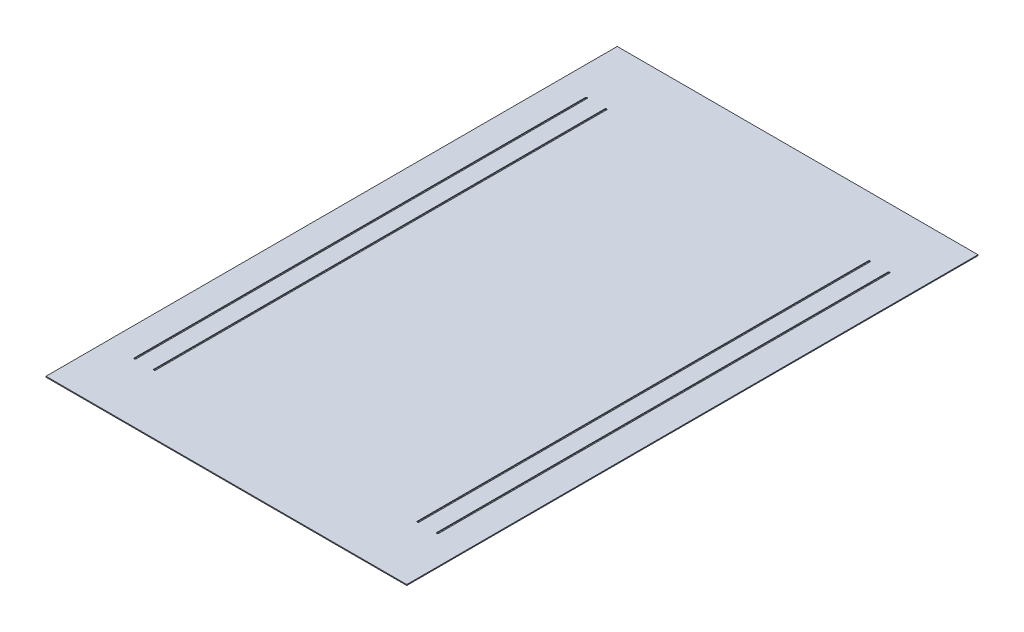
ISO-10303-21;
HEADER;
FILE_DESCRIPTION(('STEP AP214'),'2;1');
FILE_NAME('part.step','',(''),(''),'','','');
FILE_SCHEMA(('AUTOMOTIVE_DESIGN { 1 0 10303 214 1 1 1 1 }'));
ENDSEC;
DATA;
#1=APPLICATION_CONTEXT('core data for automotive mechanical design processes');
#2=APPLICATION_PROTOCOL_DEFINITION('international standard','automotive_design',2000,#1);
#3=PRODUCT_CONTEXT('',#1,'mechanical');
#4=PRODUCT('Part','Part','',(#3));
#5=PRODUCT_RELATED_PRODUCT_CATEGORY('part','',(#4));
#6=PRODUCT_DEFINITION_FORMATION('','',#4);
#7=PRODUCT_DEFINITION_CONTEXT('part definition',#1,'design');
#8=PRODUCT_DEFINITION('design','',#6,#7);
#9=PRODUCT_DEFINITION_SHAPE('','',#8);
#10=(LENGTH_UNIT() NAMED_UNIT(*) SI_UNIT(.MILLI.,.METRE.));
#11=(NAMED_UNIT(*) PLANE_ANGLE_UNIT() SI_UNIT($,.RADIAN.));
#12=(NAMED_UNIT(*) SI_UNIT($,.STERADIAN.) SOLID_ANGLE_UNIT());
#13=UNCERTAINTY_MEASURE_WITH_UNIT(LENGTH_MEASURE(1.E-05),#10,'distance_accuracy_value','');
#14=(GEOMETRIC_REPRESENTATION_CONTEXT(3) GLOBAL_UNCERTAINTY_ASSIGNED_CONTEXT((#13)) GLOBAL_UNIT_ASSIGNED_CONTEXT((#10,
#11,#12)) REPRESENTATION_CONTEXT('',''));
#15=CARTESIAN_POINT('',(0.,0.,0.));
#16=DIRECTION('',(0.,0.,1.));
#17=DIRECTION('',(1.,0.,0.));
#18=AXIS2_PLACEMENT_3D('',#15,#16,#17);
#19=CARTESIAN_POINT('',(0.,3.,0.));
#20=DIRECTION('',(0.,1.,0.));
#21=DIRECTION('',(0.,0.,1.));
#22=AXIS2_PLACEMENT_3D('',#19,#20,#21);
#23=PLANE('',#22);
#24=DIRECTION('',(0.,0.,1.));
#25=VECTOR('',#24,1.);
#26=CARTESIAN_POINT('',(435.,3.,-750.));
#27=LINE('',#26,#25);
#28=CARTESIAN_POINT('',(435.,3.,-750.));
#29=VERTEX_POINT('',#28);
#30=CARTESIAN_POINT('',(435.,3.,750.));
#31=VERTEX_POINT('',#30);
#32=EDGE_CURVE('E208',#29,#31,#27,.T.);
#33=ORIENTED_EDGE('',*,*,#32,.F.);
#34=CARTESIAN_POINT('',(438.,3.,-750.));
#35=DIRECTION('',(0.,1.,0.));
#36=DIRECTION('',(0.,0.,-1.));
#37=AXIS2_PLACEMENT_3D('',#34,#35,#36);
#38=CIRCLE('',#37,3.);
#39=CARTESIAN_POINT('',(441.,3.,-750.));
#40=VERTEX_POINT('',#39);
#41=EDGE_CURVE('E206',#40,#29,#38,.T.);
#42=ORIENTED_EDGE('',*,*,#41,.F.);
#43=DIRECTION('',(0.,0.,-1.));
#44=VECTOR('',#43,1.);
#45=CARTESIAN_POINT('',(441.,3.,-750.));
#46=LINE('',#45,#44);
#47=CARTESIAN_POINT('',(441.,3.,750.));
#48=VERTEX_POINT('',#47);
#49=EDGE_CURVE('E214',#48,#40,#46,.T.);
#50=ORIENTED_EDGE('',*,*,#49,.F.);
#51=CARTESIAN_POINT('',(438.,3.,750.));
#52=DIRECTION('',(0.,1.,0.));
#53=DIRECTION('',(0.,0.,-1.));
#54=AXIS2_PLACEMENT_3D('',#51,#52,#53);
#55=CIRCLE('',#54,3.00000000000014);
#56=EDGE_CURVE('E211',#31,#48,#55,.T.);
#57=ORIENTED_EDGE('',*,*,#56,.F.);
#58=EDGE_LOOP('',(#33,#42,#50,#57));
#59=FACE_BOUND('',#58,.T.);
#60=DIRECTION('',(0.,0.,1.));
#61=VECTOR('',#60,1.);
#62=CARTESIAN_POINT('',(-506.,3.,-750.));
#63=LINE('',#62,#61);
#64=CARTESIAN_POINT('',(-506.,3.,-750.));
#65=VERTEX_POINT('',#64);
#66=CARTESIAN_POINT('',(-506.,3.,750.));
#67=VERTEX_POINT('',#66);
#68=EDGE_CURVE('E270',#65,#67,#63,.T.);
#69=ORIENTED_EDGE('',*,*,#68,.F.);
#70=CARTESIAN_POINT('',(-503.,3.,-750.));
#71=DIRECTION('',(0.,1.,0.));
#72=DIRECTION('',(0.,0.,1.));
#73=AXIS2_PLACEMENT_3D('',#70,#71,#72);
#74=CIRCLE('',#73,3.);
#75=CARTESIAN_POINT('',(-500.,3.,-750.));
#76=VERTEX_POINT('',#75);
#77=EDGE_CURVE('E268',#76,#65,#74,.T.);
#78=ORIENTED_EDGE('',*,*,#77,.F.);
#79=DIRECTION('',(0.,0.,-1.));
#80=VECTOR('',#79,1.);
#81=CARTESIAN_POINT('',(-500.,3.,-750.));
#82=LINE('',#81,#80);
#83=CARTESIAN_POINT('',(-500.,3.,750.));
#84=VERTEX_POINT('',#83);
#85=EDGE_CURVE('E276',#84,#76,#82,.T.);
#86=ORIENTED_EDGE('',*,*,#85,.F.);
#87=CARTESIAN_POINT('',(-503.,3.,750.));
#88=DIRECTION('',(0.,1.,0.));
#89=DIRECTION('',(0.,0.,1.));
#90=AXIS2_PLACEMENT_3D('',#87,#88,#89);
#91=CIRCLE('',#90,2.99999999999995);
#92=EDGE_CURVE('E273',#67,#84,#91,.T.);
#93=ORIENTED_EDGE('',*,*,#92,.F.);
#94=EDGE_LOOP('',(#69,#78,#86,#93));
#95=FACE_BOUND('',#94,.T.);
#96=DIRECTION('',(0.,0.,1.));
#97=VECTOR('',#96,1.);
#98=CARTESIAN_POINT('',(-600.,3.,-950.));
#99=LINE('',#98,#97);
#100=CARTESIAN_POINT('',(-600.,3.,-950.));
#101=VERTEX_POINT('',#100);
#102=CARTESIAN_POINT('',(-600.,3.,950.));
#103=VERTEX_POINT('',#102);
#104=EDGE_CURVE('E299',#101,#103,#99,.T.);
#105=ORIENTED_EDGE('',*,*,#104,.T.);
#106=DIRECTION('',(1.,0.,0.));
#107=VECTOR('',#106,1.);
#108=CARTESIAN_POINT('',(-600.,3.,950.));
#109=LINE('',#108,#107);
#110=CARTESIAN_POINT('',(600.,3.,950.));
#111=VERTEX_POINT('',#110);
#112=EDGE_CURVE('E302',#103,#111,#109,.T.);
#113=ORIENTED_EDGE('',*,*,#112,.T.);
#114=DIRECTION('',(0.,0.,-1.));
#115=VECTOR('',#114,1.);
#116=CARTESIAN_POINT('',(600.,3.,-950.));
#117=LINE('',#116,#115);
#118=CARTESIAN_POINT('',(600.,3.,-950.));
#119=VERTEX_POINT('',#118);
#120=EDGE_CURVE('E305',#111,#119,#117,.T.);
#121=ORIENTED_EDGE('',*,*,#120,.T.);
#122=DIRECTION('',(-1.,0.,0.));
#123=VECTOR('',#122,1.);
#124=CARTESIAN_POINT('',(-600.,3.,-950.));
#125=LINE('',#124,#123);
#126=EDGE_CURVE('E307',#119,#101,#125,.T.);
#127=ORIENTED_EDGE('',*,*,#126,.T.);
#128=EDGE_LOOP('',(#105,#113,#121,#127));
#129=FACE_BOUND('',#128,.T.);
#130=DIRECTION('',(0.,0.,1.));
#131=VECTOR('',#130,1.);
#132=CARTESIAN_POINT('',(-441.,3.,-750.));
#133=LINE('',#132,#131);
#134=CARTESIAN_POINT('',(-441.,3.,-750.));
#135=VERTEX_POINT('',#134);
#136=CARTESIAN_POINT('',(-441.,3.,750.));
#137=VERTEX_POINT('',#136);
#138=EDGE_CURVE('E239',#135,#137,#133,.T.);
#139=ORIENTED_EDGE('',*,*,#138,.F.);
#140=CARTESIAN_POINT('',(-438.,3.,-750.));
#141=DIRECTION('',(0.,1.,0.));
#142=DIRECTION('',(0.,0.,1.));
#143=AXIS2_PLACEMENT_3D('',#140,#141,#142);
#144=CIRCLE('',#143,3.);
#145=CARTESIAN_POINT('',(-435.,3.,-750.));
#146=VERTEX_POINT('',#145);
#147=EDGE_CURVE('E237',#146,#135,#144,.T.);
#148=ORIENTED_EDGE('',*,*,#147,.F.);
#149=DIRECTION('',(0.,0.,-1.));
#150=VECTOR('',#149,1.);
#151=CARTESIAN_POINT('',(-435.,3.,-750.));
#152=LINE('',#151,#150);
#153=CARTESIAN_POINT('',(-435.,3.,750.));
#154=VERTEX_POINT('',#153);
#155=EDGE_CURVE('E245',#154,#146,#152,.T.);
#156=ORIENTED_EDGE('',*,*,#155,.F.);
#157=CARTESIAN_POINT('',(-438.,3.,750.));
#158=DIRECTION('',(0.,1.,0.));
#159=DIRECTION('',(0.,0.,1.));
#160=AXIS2_PLACEMENT_3D('',#157,#158,#159);
#161=CIRCLE('',#160,3.00000000000014);
#162=EDGE_CURVE('E242',#137,#154,#161,.T.);
#163=ORIENTED_EDGE('',*,*,#162,.F.);
#164=EDGE_LOOP('',(#139,#148,#156,#163));
#165=FACE_BOUND('',#164,.T.);
#166=DIRECTION('',(0.,0.,1.));
#167=VECTOR('',#166,1.);
#168=CARTESIAN_POINT('',(500.,3.,-750.));
#169=LINE('',#168,#167);
#170=CARTESIAN_POINT('',(500.,3.,-750.));
#171=VERTEX_POINT('',#170);
#172=CARTESIAN_POINT('',(500.,3.,750.));
#173=VERTEX_POINT('',#172);
#174=EDGE_CURVE('E178',#171,#173,#169,.T.);
#175=ORIENTED_EDGE('',*,*,#174,.F.);
#176=CARTESIAN_POINT('',(503.,3.,-750.));
#177=DIRECTION('',(0.,1.,0.));
#178=DIRECTION('',(0.,0.,-1.));
#179=AXIS2_PLACEMENT_3D('',#176,#177,#178);
#180=CIRCLE('',#179,3.);
#181=CARTESIAN_POINT('',(506.,3.,-750.));
#182=VERTEX_POINT('',#181);
#183=EDGE_CURVE('E170',#182,#171,#180,.T.);
#184=ORIENTED_EDGE('',*,*,#183,.F.);
#185=DIRECTION('',(0.,0.,-1.));
#186=VECTOR('',#185,1.);
#187=CARTESIAN_POINT('',(506.,3.,-750.));
#188=LINE('',#187,#186);
#189=CARTESIAN_POINT('',(506.,3.,750.));
#190=VERTEX_POINT('',#189);
#191=EDGE_CURVE('E192',#190,#182,#188,.T.);
#192=ORIENTED_EDGE('',*,*,#191,.F.);
#193=CARTESIAN_POINT('',(503.,3.,750.));
#194=DIRECTION('',(0.,1.,0.));
#195=DIRECTION('',(0.,0.,-1.));
#196=AXIS2_PLACEMENT_3D('',#193,#194,#195);
#197=CIRCLE('',#196,3.);
#198=EDGE_CURVE('E190',#173,#190,#197,.T.);
#199=ORIENTED_EDGE('',*,*,#198,.F.);
#200=EDGE_LOOP('',(#175,#184,#192,#199));
#201=FACE_BOUND('',#200,.T.);
#202=ADVANCED_FACE('F33',(#59,#95,#129,#165,#201),#23,.T.);
#203=CARTESIAN_POINT('',(0.,0.,0.));
#204=DIRECTION('',(0.,1.,0.));
#205=DIRECTION('',(0.,0.,1.));
#206=AXIS2_PLACEMENT_3D('',#203,#204,#205);
#207=PLANE('',#206);
#208=CARTESIAN_POINT('',(438.,0.,-750.));
#209=DIRECTION('',(0.,1.,0.));
#210=DIRECTION('',(0.,0.,-1.));
#211=AXIS2_PLACEMENT_3D('',#208,#209,#210);
#212=CIRCLE('',#211,3.);
#213=CARTESIAN_POINT('',(441.,0.,-750.));
#214=VERTEX_POINT('',#213);
#215=CARTESIAN_POINT('',(435.,0.,-750.));
#216=VERTEX_POINT('',#215);
#217=EDGE_CURVE('E186',#214,#216,#212,.T.);
#218=ORIENTED_EDGE('',*,*,#217,.T.);
#219=DIRECTION('',(0.,0.,1.));
#220=VECTOR('',#219,1.);
#221=CARTESIAN_POINT('',(435.,0.,-750.));
#222=LINE('',#221,#220);
#223=CARTESIAN_POINT('',(435.,0.,750.));
#224=VERTEX_POINT('',#223);
#225=EDGE_CURVE('E219',#216,#224,#222,.T.);
#226=ORIENTED_EDGE('',*,*,#225,.T.);
#227=CARTESIAN_POINT('',(438.,0.,750.));
#228=DIRECTION('',(0.,1.,0.));
#229=DIRECTION('',(0.,0.,-1.));
#230=AXIS2_PLACEMENT_3D('',#227,#228,#229);
#231=CIRCLE('',#230,3.00000000000014);
#232=CARTESIAN_POINT('',(441.,0.,750.));
#233=VERTEX_POINT('',#232);
#234=EDGE_CURVE('E222',#224,#233,#231,.T.);
#235=ORIENTED_EDGE('',*,*,#234,.T.);
#236=DIRECTION('',(0.,0.,-1.));
#237=VECTOR('',#236,1.);
#238=CARTESIAN_POINT('',(441.,0.,-750.));
#239=LINE('',#238,#237);
#240=EDGE_CURVE('E209',#233,#214,#239,.T.);
#241=ORIENTED_EDGE('',*,*,#240,.T.);
#242=EDGE_LOOP('',(#218,#226,#235,#241));
#243=FACE_BOUND('',#242,.T.);
#244=CARTESIAN_POINT('',(-503.,0.,-750.));
#245=DIRECTION('',(0.,1.,0.));
#246=DIRECTION('',(0.,0.,1.));
#247=AXIS2_PLACEMENT_3D('',#244,#245,#246);
#248=CIRCLE('',#247,3.);
#249=CARTESIAN_POINT('',(-500.,0.,-750.));
#250=VERTEX_POINT('',#249);
#251=CARTESIAN_POINT('',(-506.,0.,-750.));
#252=VERTEX_POINT('',#251);
#253=EDGE_CURVE('E267',#250,#252,#248,.T.);
#254=ORIENTED_EDGE('',*,*,#253,.T.);
#255=DIRECTION('',(0.,0.,1.));
#256=VECTOR('',#255,1.);
#257=CARTESIAN_POINT('',(-506.,0.,-750.));
#258=LINE('',#257,#256);
#259=CARTESIAN_POINT('',(-506.,0.,750.));
#260=VERTEX_POINT('',#259);
#261=EDGE_CURVE('E281',#252,#260,#258,.T.);
#262=ORIENTED_EDGE('',*,*,#261,.T.);
#263=CARTESIAN_POINT('',(-503.,0.,750.));
#264=DIRECTION('',(0.,1.,0.));
#265=DIRECTION('',(0.,0.,1.));
#266=AXIS2_PLACEMENT_3D('',#263,#264,#265);
#267=CIRCLE('',#266,2.99999999999995);
#268=CARTESIAN_POINT('',(-500.,0.,750.));
#269=VERTEX_POINT('',#268);
#270=EDGE_CURVE('E284',#260,#269,#267,.T.);
#271=ORIENTED_EDGE('',*,*,#270,.T.);
#272=DIRECTION('',(0.,0.,-1.));
#273=VECTOR('',#272,1.);
#274=CARTESIAN_POINT('',(-500.,0.,-750.));
#275=LINE('',#274,#273);
#276=EDGE_CURVE('E271',#269,#250,#275,.T.);
#277=ORIENTED_EDGE('',*,*,#276,.T.);
#278=EDGE_LOOP('',(#254,#262,#271,#277));
#279=FACE_BOUND('',#278,.T.);
#280=DIRECTION('',(0.,0.,1.));
#281=VECTOR('',#280,1.);
#282=CARTESIAN_POINT('',(-600.,0.,-950.));
#283=LINE('',#282,#281);
#284=CARTESIAN_POINT('',(-600.,0.,-950.));
#285=VERTEX_POINT('',#284);
#286=CARTESIAN_POINT('',(-600.,0.,950.));
#287=VERTEX_POINT('',#286);
#288=EDGE_CURVE('E298',#285,#287,#283,.T.);
#289=ORIENTED_EDGE('',*,*,#288,.F.);
#290=DIRECTION('',(-1.,0.,0.));
#291=VECTOR('',#290,1.);
#292=CARTESIAN_POINT('',(-600.,0.,-950.));
#293=LINE('',#292,#291);
#294=CARTESIAN_POINT('',(600.,0.,-950.));
#295=VERTEX_POINT('',#294);
#296=EDGE_CURVE('E303',#295,#285,#293,.T.);
#297=ORIENTED_EDGE('',*,*,#296,.F.);
#298=DIRECTION('',(0.,0.,-1.));
#299=VECTOR('',#298,1.);
#300=CARTESIAN_POINT('',(600.,0.,-950.));
#301=LINE('',#300,#299);
#302=CARTESIAN_POINT('',(600.,0.,950.));
#303=VERTEX_POINT('',#302);
#304=EDGE_CURVE('E314',#303,#295,#301,.T.);
#305=ORIENTED_EDGE('',*,*,#304,.F.);
#306=DIRECTION('',(1.,0.,0.));
#307=VECTOR('',#306,1.);
#308=CARTESIAN_POINT('',(-600.,0.,950.));
#309=LINE('',#308,#307);
#310=EDGE_CURVE('E312',#287,#303,#309,.T.);
#311=ORIENTED_EDGE('',*,*,#310,.F.);
#312=EDGE_LOOP('',(#289,#297,#305,#311));
#313=FACE_BOUND('',#312,.T.);
#314=CARTESIAN_POINT('',(-438.,0.,-750.));
#315=DIRECTION('',(0.,1.,0.));
#316=DIRECTION('',(0.,0.,1.));
#317=AXIS2_PLACEMENT_3D('',#314,#315,#316);
#318=CIRCLE('',#317,3.);
#319=CARTESIAN_POINT('',(-435.,0.,-750.));
#320=VERTEX_POINT('',#319);
#321=CARTESIAN_POINT('',(-441.,0.,-750.));
#322=VERTEX_POINT('',#321);
#323=EDGE_CURVE('E236',#320,#322,#318,.T.);
#324=ORIENTED_EDGE('',*,*,#323,.T.);
#325=DIRECTION('',(0.,0.,1.));
#326=VECTOR('',#325,1.);
#327=CARTESIAN_POINT('',(-441.,0.,-750.));
#328=LINE('',#327,#326);
#329=CARTESIAN_POINT('',(-441.,0.,750.));
#330=VERTEX_POINT('',#329);
#331=EDGE_CURVE('E250',#322,#330,#328,.T.);
#332=ORIENTED_EDGE('',*,*,#331,.T.);
#333=CARTESIAN_POINT('',(-438.,0.,750.));
#334=DIRECTION('',(0.,1.,0.));
#335=DIRECTION('',(0.,0.,1.));
#336=AXIS2_PLACEMENT_3D('',#333,#334,#335);
#337=CIRCLE('',#336,3.00000000000014);
#338=CARTESIAN_POINT('',(-435.,0.,750.));
#339=VERTEX_POINT('',#338);
#340=EDGE_CURVE('E253',#330,#339,#337,.T.);
#341=ORIENTED_EDGE('',*,*,#340,.T.);
#342=DIRECTION('',(0.,0.,-1.));
#343=VECTOR('',#342,1.);
#344=CARTESIAN_POINT('',(-435.,0.,-750.));
#345=LINE('',#344,#343);
#346=EDGE_CURVE('E240',#339,#320,#345,.T.);
#347=ORIENTED_EDGE('',*,*,#346,.T.);
#348=EDGE_LOOP('',(#324,#332,#341,#347));
#349=FACE_BOUND('',#348,.T.);
#350=CARTESIAN_POINT('',(503.,0.,-750.));
#351=DIRECTION('',(0.,1.,0.));
#352=DIRECTION('',(0.,0.,-1.));
#353=AXIS2_PLACEMENT_3D('',#350,#351,#352);
#354=CIRCLE('',#353,3.);
#355=CARTESIAN_POINT('',(506.,0.,-750.));
#356=VERTEX_POINT('',#355);
#357=CARTESIAN_POINT('',(500.,0.,-750.));
#358=VERTEX_POINT('',#357);
#359=EDGE_CURVE('E56',#356,#358,#354,.T.);
#360=ORIENTED_EDGE('',*,*,#359,.T.);
#361=DIRECTION('',(0.,0.,1.));
#362=VECTOR('',#361,1.);
#363=CARTESIAN_POINT('',(500.,0.,-750.));
#364=LINE('',#363,#362);
#365=CARTESIAN_POINT('',(500.,0.,750.));
#366=VERTEX_POINT('',#365);
#367=EDGE_CURVE('E185',#358,#366,#364,.T.);
#368=ORIENTED_EDGE('',*,*,#367,.T.);
#369=CARTESIAN_POINT('',(503.,0.,750.));
#370=DIRECTION('',(0.,1.,0.));
#371=DIRECTION('',(0.,0.,-1.));
#372=AXIS2_PLACEMENT_3D('',#369,#370,#371);
#373=CIRCLE('',#372,3.);
#374=CARTESIAN_POINT('',(506.,0.,750.));
#375=VERTEX_POINT('',#374);
#376=EDGE_CURVE('E198',#366,#375,#373,.T.);
#377=ORIENTED_EDGE('',*,*,#376,.T.);
#378=DIRECTION('',(0.,0.,-1.));
#379=VECTOR('',#378,1.);
#380=CARTESIAN_POINT('',(506.,0.,-750.));
#381=LINE('',#380,#379);
#382=EDGE_CURVE('E179',#375,#356,#381,.T.);
#383=ORIENTED_EDGE('',*,*,#382,.T.);
#384=EDGE_LOOP('',(#360,#368,#377,#383));
#385=FACE_BOUND('',#384,.T.);
#386=ADVANCED_FACE('F332',(#243,#279,#313,#349,#385),#207,.F.);
#387=CARTESIAN_POINT('',(-600.,3.,-950.));
#388=DIRECTION('',(1.,0.,0.));
#389=DIRECTION('',(0.,0.,-1.));
#390=AXIS2_PLACEMENT_3D('',#387,#388,#389);
#391=PLANE('',#390);
#392=ORIENTED_EDGE('',*,*,#288,.T.);
#393=DIRECTION('',(0.,-1.,0.));
#394=VECTOR('',#393,1.);
#395=CARTESIAN_POINT('',(-600.,3.,950.));
#396=LINE('',#395,#394);
#397=EDGE_CURVE('E11',#103,#287,#396,.T.);
#398=ORIENTED_EDGE('',*,*,#397,.F.);
#399=ORIENTED_EDGE('',*,*,#104,.F.);
#400=DIRECTION('',(0.,-1.,0.));
#401=VECTOR('',#400,1.);
#402=CARTESIAN_POINT('',(-600.,3.,-950.));
#403=LINE('',#402,#401);
#404=EDGE_CURVE('E309',#101,#285,#403,.T.);
#405=ORIENTED_EDGE('',*,*,#404,.T.);
#406=EDGE_LOOP('',(#392,#398,#399,#405));
#407=FACE_BOUND('',#406,.T.);
#408=ADVANCED_FACE('F35',(#407),#391,.F.);
#409=CARTESIAN_POINT('',(-600.,3.,950.));
#410=DIRECTION('',(0.,0.,-1.));
#411=DIRECTION('',(-1.,0.,0.));
#412=AXIS2_PLACEMENT_3D('',#409,#410,#411);
#413=PLANE('',#412);
#414=ORIENTED_EDGE('',*,*,#310,.T.);
#415=DIRECTION('',(0.,-1.,0.));
#416=VECTOR('',#415,1.);
#417=CARTESIAN_POINT('',(600.,3.,950.));
#418=LINE('',#417,#416);
#419=EDGE_CURVE('E41',#111,#303,#418,.T.);
#420=ORIENTED_EDGE('',*,*,#419,.F.);
#421=ORIENTED_EDGE('',*,*,#112,.F.);
#422=ORIENTED_EDGE('',*,*,#397,.T.);
#423=EDGE_LOOP('',(#414,#420,#421,#422));
#424=FACE_BOUND('',#423,.T.);
#425=ADVANCED_FACE('F343',(#424),#413,.F.);
#426=CARTESIAN_POINT('',(600.,3.,-950.));
#427=DIRECTION('',(-1.,0.,0.));
#428=DIRECTION('',(0.,0.,1.));
#429=AXIS2_PLACEMENT_3D('',#426,#427,#428);
#430=PLANE('',#429);
#431=ORIENTED_EDGE('',*,*,#304,.T.);
#432=DIRECTION('',(0.,-1.,0.));
#433=VECTOR('',#432,1.);
#434=CARTESIAN_POINT('',(600.,3.,-950.));
#435=LINE('',#434,#433);
#436=EDGE_CURVE('E319',#119,#295,#435,.T.);
#437=ORIENTED_EDGE('',*,*,#436,.F.);
#438=ORIENTED_EDGE('',*,*,#120,.F.);
#439=ORIENTED_EDGE('',*,*,#419,.T.);
#440=EDGE_LOOP('',(#431,#437,#438,#439));
#441=FACE_BOUND('',#440,.T.);
#442=ADVANCED_FACE('F326',(#441),#430,.F.);
#443=CARTESIAN_POINT('',(-600.,3.,-950.));
#444=DIRECTION('',(0.,0.,1.));
#445=DIRECTION('',(1.,0.,0.));
#446=AXIS2_PLACEMENT_3D('',#443,#444,#445);
#447=PLANE('',#446);
#448=ORIENTED_EDGE('',*,*,#296,.T.);
#449=ORIENTED_EDGE('',*,*,#404,.F.);
#450=ORIENTED_EDGE('',*,*,#126,.F.);
#451=ORIENTED_EDGE('',*,*,#436,.T.);
#452=EDGE_LOOP('',(#448,#449,#450,#451));
#453=FACE_BOUND('',#452,.T.);
#454=ADVANCED_FACE('F336',(#453),#447,.F.);
#455=CARTESIAN_POINT('',(-503.,3.,-750.));
#456=DIRECTION('',(0.,-1.,0.));
#457=DIRECTION('',(0.,0.,-1.));
#458=AXIS2_PLACEMENT_3D('',#455,#456,#457);
#459=CYLINDRICAL_SURFACE('',#458,3.);
#460=ORIENTED_EDGE('',*,*,#253,.F.);
#461=DIRECTION('',(0.,-1.,0.));
#462=VECTOR('',#461,1.);
#463=CARTESIAN_POINT('',(-500.,3.,-750.));
#464=LINE('',#463,#462);
#465=EDGE_CURVE('E278',#76,#250,#464,.T.);
#466=ORIENTED_EDGE('',*,*,#465,.F.);
#467=ORIENTED_EDGE('',*,*,#77,.T.);
#468=DIRECTION('',(0.,-1.,0.));
#469=VECTOR('',#468,1.);
#470=CARTESIAN_POINT('',(-506.,3.,-750.));
#471=LINE('',#470,#469);
#472=EDGE_CURVE('E295',#65,#252,#471,.T.);
#473=ORIENTED_EDGE('',*,*,#472,.T.);
#474=EDGE_LOOP('',(#460,#466,#467,#473));
#475=FACE_BOUND('',#474,.T.);
#476=ADVANCED_FACE('F361',(#475),#459,.F.);
#477=CARTESIAN_POINT('',(-506.,3.,-750.));
#478=DIRECTION('',(1.,0.,0.));
#479=DIRECTION('',(0.,0.,-1.));
#480=AXIS2_PLACEMENT_3D('',#477,#478,#479);
#481=PLANE('',#480);
#482=ORIENTED_EDGE('',*,*,#261,.F.);
#483=ORIENTED_EDGE('',*,*,#472,.F.);
#484=ORIENTED_EDGE('',*,*,#68,.T.);
#485=DIRECTION('',(0.,-1.,0.));
#486=VECTOR('',#485,1.);
#487=CARTESIAN_POINT('',(-506.,3.,750.));
#488=LINE('',#487,#486);
#489=EDGE_CURVE('E293',#67,#260,#488,.T.);
#490=ORIENTED_EDGE('',*,*,#489,.T.);
#491=EDGE_LOOP('',(#482,#483,#484,#490));
#492=FACE_BOUND('',#491,.T.);
#493=ADVANCED_FACE('F368',(#492),#481,.T.);
#494=CARTESIAN_POINT('',(-503.,3.,750.));
#495=DIRECTION('',(0.,-1.,0.));
#496=DIRECTION('',(0.,0.,-1.));
#497=AXIS2_PLACEMENT_3D('',#494,#495,#496);
#498=CYLINDRICAL_SURFACE('',#497,2.99999999999995);
#499=ORIENTED_EDGE('',*,*,#270,.F.);
#500=ORIENTED_EDGE('',*,*,#489,.F.);
#501=ORIENTED_EDGE('',*,*,#92,.T.);
#502=DIRECTION('',(0.,-1.,0.));
#503=VECTOR('',#502,1.);
#504=CARTESIAN_POINT('',(-500.,3.,750.));
#505=LINE('',#504,#503);
#506=EDGE_CURVE('E291',#84,#269,#505,.T.);
#507=ORIENTED_EDGE('',*,*,#506,.T.);
#508=EDGE_LOOP('',(#499,#500,#501,#507));
#509=FACE_BOUND('',#508,.T.);
#510=ADVANCED_FACE('F373',(#509),#498,.F.);
#511=CARTESIAN_POINT('',(-500.,3.,-750.));
#512=DIRECTION('',(-1.,0.,0.));
#513=DIRECTION('',(0.,0.,1.));
#514=AXIS2_PLACEMENT_3D('',#511,#512,#513);
#515=PLANE('',#514);
#516=ORIENTED_EDGE('',*,*,#276,.F.);
#517=ORIENTED_EDGE('',*,*,#506,.F.);
#518=ORIENTED_EDGE('',*,*,#85,.T.);
#519=ORIENTED_EDGE('',*,*,#465,.T.);
#520=EDGE_LOOP('',(#516,#517,#518,#519));
#521=FACE_BOUND('',#520,.T.);
#522=ADVANCED_FACE('F381',(#521),#515,.T.);
#523=CARTESIAN_POINT('',(-438.,3.,-750.));
#524=DIRECTION('',(0.,-1.,0.));
#525=DIRECTION('',(0.,0.,-1.));
#526=AXIS2_PLACEMENT_3D('',#523,#524,#525);
#527=CYLINDRICAL_SURFACE('',#526,3.);
#528=ORIENTED_EDGE('',*,*,#323,.F.);
#529=DIRECTION('',(0.,-1.,0.));
#530=VECTOR('',#529,1.);
#531=CARTESIAN_POINT('',(-435.,3.,-750.));
#532=LINE('',#531,#530);
#533=EDGE_CURVE('E247',#146,#320,#532,.T.);
#534=ORIENTED_EDGE('',*,*,#533,.F.);
#535=ORIENTED_EDGE('',*,*,#147,.T.);
#536=DIRECTION('',(0.,-1.,0.));
#537=VECTOR('',#536,1.);
#538=CARTESIAN_POINT('',(-441.,3.,-750.));
#539=LINE('',#538,#537);
#540=EDGE_CURVE('E264',#135,#322,#539,.T.);
#541=ORIENTED_EDGE('',*,*,#540,.T.);
#542=EDGE_LOOP('',(#528,#534,#535,#541));
#543=FACE_BOUND('',#542,.T.);
#544=ADVANCED_FACE('F393',(#543),#527,.F.);
#545=CARTESIAN_POINT('',(-441.,3.,-750.));
#546=DIRECTION('',(1.,0.,0.));
#547=DIRECTION('',(0.,0.,-1.));
#548=AXIS2_PLACEMENT_3D('',#545,#546,#547);
#549=PLANE('',#548);
#550=ORIENTED_EDGE('',*,*,#331,.F.);
#551=ORIENTED_EDGE('',*,*,#540,.F.);
#552=ORIENTED_EDGE('',*,*,#138,.T.);
#553=DIRECTION('',(0.,-1.,0.));
#554=VECTOR('',#553,1.);
#555=CARTESIAN_POINT('',(-441.,3.,750.));
#556=LINE('',#555,#554);
#557=EDGE_CURVE('E262',#137,#330,#556,.T.);
#558=ORIENTED_EDGE('',*,*,#557,.T.);
#559=EDGE_LOOP('',(#550,#551,#552,#558));
#560=FACE_BOUND('',#559,.T.);
#561=ADVANCED_FACE('F398',(#560),#549,.T.);
#562=CARTESIAN_POINT('',(-438.,3.,750.));
#563=DIRECTION('',(0.,-1.,0.));
#564=DIRECTION('',(0.,0.,-1.));
#565=AXIS2_PLACEMENT_3D('',#562,#563,#564);
#566=CYLINDRICAL_SURFACE('',#565,3.00000000000014);
#567=ORIENTED_EDGE('',*,*,#340,.F.);
#568=ORIENTED_EDGE('',*,*,#557,.F.);
#569=ORIENTED_EDGE('',*,*,#162,.T.);
#570=DIRECTION('',(0.,-1.,0.));
#571=VECTOR('',#570,1.);
#572=CARTESIAN_POINT('',(-435.,3.,750.));
#573=LINE('',#572,#571);
#574=EDGE_CURVE('E260',#154,#339,#573,.T.);
#575=ORIENTED_EDGE('',*,*,#574,.T.);
#576=EDGE_LOOP('',(#567,#568,#569,#575));
#577=FACE_BOUND('',#576,.T.);
#578=ADVANCED_FACE('F402',(#577),#566,.F.);
#579=CARTESIAN_POINT('',(-435.,3.,-750.));
#580=DIRECTION('',(-1.,0.,0.));
#581=DIRECTION('',(0.,0.,1.));
#582=AXIS2_PLACEMENT_3D('',#579,#580,#581);
#583=PLANE('',#582);
#584=ORIENTED_EDGE('',*,*,#346,.F.);
#585=ORIENTED_EDGE('',*,*,#574,.F.);
#586=ORIENTED_EDGE('',*,*,#155,.T.);
#587=ORIENTED_EDGE('',*,*,#533,.T.);
#588=EDGE_LOOP('',(#584,#585,#586,#587));
#589=FACE_BOUND('',#588,.T.);
#590=ADVANCED_FACE('F406',(#589),#583,.T.);
#591=CARTESIAN_POINT('',(438.,3.,-750.));
#592=DIRECTION('',(0.,-1.,0.));
#593=DIRECTION('',(0.,0.,-1.));
#594=AXIS2_PLACEMENT_3D('',#591,#592,#593);
#595=CYLINDRICAL_SURFACE('',#594,3.);
#596=ORIENTED_EDGE('',*,*,#217,.F.);
#597=DIRECTION('',(0.,-1.,0.));
#598=VECTOR('',#597,1.);
#599=CARTESIAN_POINT('',(441.,3.,-750.));
#600=LINE('',#599,#598);
#601=EDGE_CURVE('E216',#40,#214,#600,.T.);
#602=ORIENTED_EDGE('',*,*,#601,.F.);
#603=ORIENTED_EDGE('',*,*,#41,.T.);
#604=DIRECTION('',(0.,-1.,0.));
#605=VECTOR('',#604,1.);
#606=CARTESIAN_POINT('',(435.,3.,-750.));
#607=LINE('',#606,#605);
#608=EDGE_CURVE('E233',#29,#216,#607,.T.);
#609=ORIENTED_EDGE('',*,*,#608,.T.);
#610=EDGE_LOOP('',(#596,#602,#603,#609));
#611=FACE_BOUND('',#610,.T.);
#612=ADVANCED_FACE('F410',(#611),#595,.F.);
#613=CARTESIAN_POINT('',(435.,3.,-750.));
#614=DIRECTION('',(1.,0.,0.));
#615=DIRECTION('',(0.,0.,-1.));
#616=AXIS2_PLACEMENT_3D('',#613,#614,#615);
#617=PLANE('',#616);
#618=ORIENTED_EDGE('',*,*,#225,.F.);
#619=ORIENTED_EDGE('',*,*,#608,.F.);
#620=ORIENTED_EDGE('',*,*,#32,.T.);
#621=DIRECTION('',(0.,-1.,0.));
#622=VECTOR('',#621,1.);
#623=CARTESIAN_POINT('',(435.,3.,750.));
#624=LINE('',#623,#622);
#625=EDGE_CURVE('E231',#31,#224,#624,.T.);
#626=ORIENTED_EDGE('',*,*,#625,.T.);
#627=EDGE_LOOP('',(#618,#619,#620,#626));
#628=FACE_BOUND('',#627,.T.);
#629=ADVANCED_FACE('F414',(#628),#617,.T.);
#630=CARTESIAN_POINT('',(438.,3.,750.));
#631=DIRECTION('',(0.,-1.,0.));
#632=DIRECTION('',(0.,0.,-1.));
#633=AXIS2_PLACEMENT_3D('',#630,#631,#632);
#634=CYLINDRICAL_SURFACE('',#633,3.00000000000014);
#635=ORIENTED_EDGE('',*,*,#234,.F.);
#636=ORIENTED_EDGE('',*,*,#625,.F.);
#637=ORIENTED_EDGE('',*,*,#56,.T.);
#638=DIRECTION('',(0.,-1.,0.));
#639=VECTOR('',#638,1.);
#640=CARTESIAN_POINT('',(441.,3.,750.));
#641=LINE('',#640,#639);
#642=EDGE_CURVE('E229',#48,#233,#641,.T.);
#643=ORIENTED_EDGE('',*,*,#642,.T.);
#644=EDGE_LOOP('',(#635,#636,#637,#643));
#645=FACE_BOUND('',#644,.T.);
#646=ADVANCED_FACE('F418',(#645),#634,.F.);
#647=CARTESIAN_POINT('',(441.,3.,-750.));
#648=DIRECTION('',(-1.,0.,0.));
#649=DIRECTION('',(0.,0.,1.));
#650=AXIS2_PLACEMENT_3D('',#647,#648,#649);
#651=PLANE('',#650);
#652=ORIENTED_EDGE('',*,*,#240,.F.);
#653=ORIENTED_EDGE('',*,*,#642,.F.);
#654=ORIENTED_EDGE('',*,*,#49,.T.);
#655=ORIENTED_EDGE('',*,*,#601,.T.);
#656=EDGE_LOOP('',(#652,#653,#654,#655));
#657=FACE_BOUND('',#656,.T.);
#658=ADVANCED_FACE('F422',(#657),#651,.T.);
#659=CARTESIAN_POINT('',(503.,3.,-750.));
#660=DIRECTION('',(0.,-1.,0.));
#661=DIRECTION('',(0.,0.,-1.));
#662=AXIS2_PLACEMENT_3D('',#659,#660,#661);
#663=CYLINDRICAL_SURFACE('',#662,3.);
#664=ORIENTED_EDGE('',*,*,#359,.F.);
#665=DIRECTION('',(0.,-1.,0.));
#666=VECTOR('',#665,1.);
#667=CARTESIAN_POINT('',(506.,3.,-750.));
#668=LINE('',#667,#666);
#669=EDGE_CURVE('E174',#182,#356,#668,.T.);
#670=ORIENTED_EDGE('',*,*,#669,.F.);
#671=ORIENTED_EDGE('',*,*,#183,.T.);
#672=DIRECTION('',(0.,-1.,0.));
#673=VECTOR('',#672,1.);
#674=CARTESIAN_POINT('',(500.,3.,-750.));
#675=LINE('',#674,#673);
#676=EDGE_CURVE('E173',#171,#358,#675,.T.);
#677=ORIENTED_EDGE('',*,*,#676,.T.);
#678=EDGE_LOOP('',(#664,#670,#671,#677));
#679=FACE_BOUND('',#678,.T.);
#680=ADVANCED_FACE('F172',(#679),#663,.F.);
#681=CARTESIAN_POINT('',(500.,3.,-750.));
#682=DIRECTION('',(1.,0.,0.));
#683=DIRECTION('',(0.,0.,-1.));
#684=AXIS2_PLACEMENT_3D('',#681,#682,#683);
#685=PLANE('',#684);
#686=ORIENTED_EDGE('',*,*,#367,.F.);
#687=ORIENTED_EDGE('',*,*,#676,.F.);
#688=ORIENTED_EDGE('',*,*,#174,.T.);
#689=DIRECTION('',(0.,-1.,0.));
#690=VECTOR('',#689,1.);
#691=CARTESIAN_POINT('',(500.,3.,750.));
#692=LINE('',#691,#690);
#693=EDGE_CURVE('E187',#173,#366,#692,.T.);
#694=ORIENTED_EDGE('',*,*,#693,.T.);
#695=EDGE_LOOP('',(#686,#687,#688,#694));
#696=FACE_BOUND('',#695,.T.);
#697=ADVANCED_FACE('F182',(#696),#685,.T.);
#698=CARTESIAN_POINT('',(503.,3.,750.));
#699=DIRECTION('',(0.,-1.,0.));
#700=DIRECTION('',(0.,0.,-1.));
#701=AXIS2_PLACEMENT_3D('',#698,#699,#700);
#702=CYLINDRICAL_SURFACE('',#701,3.);
#703=ORIENTED_EDGE('',*,*,#376,.F.);
#704=ORIENTED_EDGE('',*,*,#693,.F.);
#705=ORIENTED_EDGE('',*,*,#198,.T.);
#706=DIRECTION('',(0.,-1.,0.));
#707=VECTOR('',#706,1.);
#708=CARTESIAN_POINT('',(506.,3.,750.));
#709=LINE('',#708,#707);
#710=EDGE_CURVE('E48',#190,#375,#709,.T.);
#711=ORIENTED_EDGE('',*,*,#710,.T.);
#712=EDGE_LOOP('',(#703,#704,#705,#711));
#713=FACE_BOUND('',#712,.T.);
#714=ADVANCED_FACE('F431',(#713),#702,.F.);
#715=CARTESIAN_POINT('',(506.,3.,-750.));
#716=DIRECTION('',(-1.,0.,0.));
#717=DIRECTION('',(0.,0.,1.));
#718=AXIS2_PLACEMENT_3D('',#715,#716,#717);
#719=PLANE('',#718);
#720=ORIENTED_EDGE('',*,*,#382,.F.);
#721=ORIENTED_EDGE('',*,*,#710,.F.);
#722=ORIENTED_EDGE('',*,*,#191,.T.);
#723=ORIENTED_EDGE('',*,*,#669,.T.);
#724=EDGE_LOOP('',(#720,#721,#722,#723));
#725=FACE_BOUND('',#724,.T.);
#726=ADVANCED_FACE('F434',(#725),#719,.T.);
#727=CLOSED_SHELL('',(#202,#386,#408,#425,#442,#454,#476,#493,#510,#522,#544,#561,#578,#590,
#612,#629,#646,#658,#680,#697,#714,#726));
#728=MANIFOLD_SOLID_BREP('B2',#727);
#729=ADVANCED_BREP_SHAPE_REPRESENTATION('',(#18,#728),#14);
#730=SHAPE_DEFINITION_REPRESENTATION(#9,#729);
ENDSEC;
END-ISO-10303-21;
